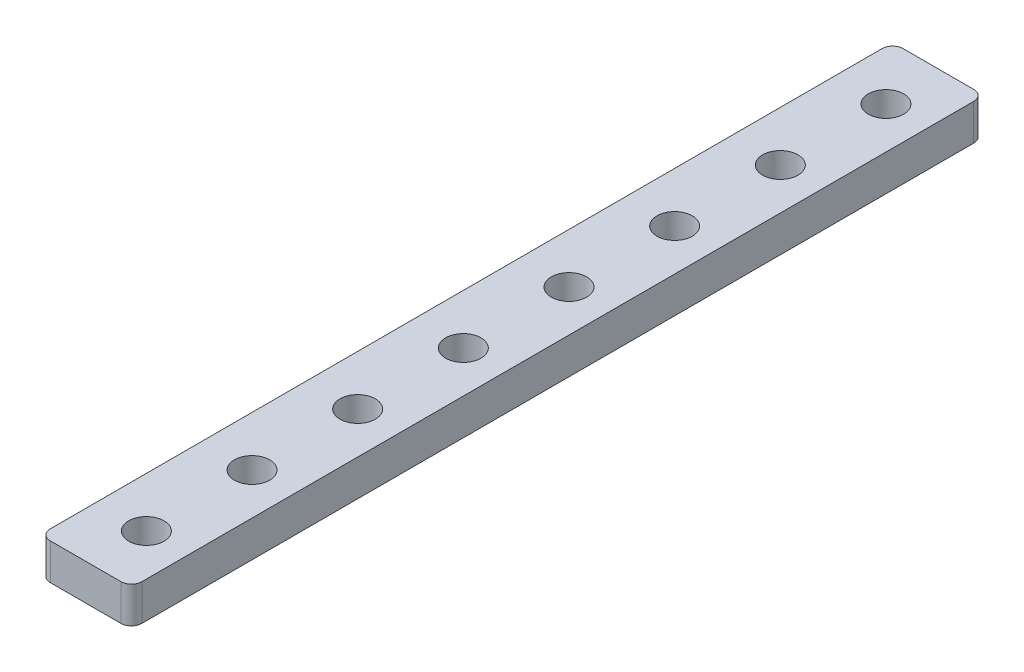
ISO-10303-21;
HEADER;
FILE_DESCRIPTION(('STEP AP214'),'2;1');
FILE_NAME('part.step','',(''),(''),'','','');
FILE_SCHEMA(('AUTOMOTIVE_DESIGN { 1 0 10303 214 1 1 1 1 }'));
ENDSEC;
DATA;
#1=APPLICATION_CONTEXT('core data for automotive mechanical design processes');
#2=APPLICATION_PROTOCOL_DEFINITION('international standard','automotive_design',2000,#1);
#3=PRODUCT_CONTEXT('',#1,'mechanical');
#4=PRODUCT('Part','Part','',(#3));
#5=PRODUCT_RELATED_PRODUCT_CATEGORY('part','',(#4));
#6=PRODUCT_DEFINITION_FORMATION('','',#4);
#7=PRODUCT_DEFINITION_CONTEXT('part definition',#1,'design');
#8=PRODUCT_DEFINITION('design','',#6,#7);
#9=PRODUCT_DEFINITION_SHAPE('','',#8);
#10=(LENGTH_UNIT() NAMED_UNIT(*) SI_UNIT(.MILLI.,.METRE.));
#11=(NAMED_UNIT(*) PLANE_ANGLE_UNIT() SI_UNIT($,.RADIAN.));
#12=(NAMED_UNIT(*) SI_UNIT($,.STERADIAN.) SOLID_ANGLE_UNIT());
#13=UNCERTAINTY_MEASURE_WITH_UNIT(LENGTH_MEASURE(1.E-05),#10,'distance_accuracy_value','');
#14=(GEOMETRIC_REPRESENTATION_CONTEXT(3) GLOBAL_UNCERTAINTY_ASSIGNED_CONTEXT((#13)) GLOBAL_UNIT_ASSIGNED_CONTEXT((#10,
#11,#12)) REPRESENTATION_CONTEXT('',''));
#15=CARTESIAN_POINT('',(0.,0.,0.));
#16=DIRECTION('',(0.,0.,1.));
#17=DIRECTION('',(1.,0.,0.));
#18=AXIS2_PLACEMENT_3D('',#15,#16,#17);
#19=CARTESIAN_POINT('',(0.,0.,0.));
#20=DIRECTION('',(0.,1.,0.));
#21=DIRECTION('',(0.,0.,1.));
#22=AXIS2_PLACEMENT_3D('',#19,#20,#21);
#23=PLANE('',#22);
#24=CARTESIAN_POINT('',(0.,0.,-88.9));
#25=DIRECTION('',(0.,-1.,0.));
#26=DIRECTION('',(0.,0.,-1.));
#27=AXIS2_PLACEMENT_3D('',#24,#25,#26);
#28=CIRCLE('',#27,4.24999999999999);
#29=CARTESIAN_POINT('',(0.,0.,-93.15));
#30=VERTEX_POINT('',#29);
#31=EDGE_CURVE('E271',#30,#30,#28,.T.);
#32=ORIENTED_EDGE('',*,*,#31,.F.);
#33=EDGE_LOOP('',(#32));
#34=FACE_BOUND('',#33,.T.);
#35=CARTESIAN_POINT('',(0.,0.,-63.5));
#36=DIRECTION('',(0.,-1.,0.));
#37=DIRECTION('',(0.,0.,-1.));
#38=AXIS2_PLACEMENT_3D('',#35,#36,#37);
#39=CIRCLE('',#38,4.24999999999999);
#40=CARTESIAN_POINT('',(0.,0.,-67.75));
#41=VERTEX_POINT('',#40);
#42=EDGE_CURVE('E263',#41,#41,#39,.T.);
#43=ORIENTED_EDGE('',*,*,#42,.F.);
#44=EDGE_LOOP('',(#43));
#45=FACE_BOUND('',#44,.T.);
#46=CARTESIAN_POINT('',(0.,0.,-38.1));
#47=DIRECTION('',(0.,-1.,0.));
#48=DIRECTION('',(0.,0.,-1.));
#49=AXIS2_PLACEMENT_3D('',#46,#47,#48);
#50=CIRCLE('',#49,4.24999999999999);
#51=CARTESIAN_POINT('',(0.,0.,-42.35));
#52=VERTEX_POINT('',#51);
#53=EDGE_CURVE('E255',#52,#52,#50,.T.);
#54=ORIENTED_EDGE('',*,*,#53,.F.);
#55=EDGE_LOOP('',(#54));
#56=FACE_BOUND('',#55,.T.);
#57=CARTESIAN_POINT('',(0.,0.,-12.7));
#58=DIRECTION('',(0.,-1.,0.));
#59=DIRECTION('',(0.,0.,-1.));
#60=AXIS2_PLACEMENT_3D('',#57,#58,#59);
#61=CIRCLE('',#60,4.24999999999999);
#62=CARTESIAN_POINT('',(0.,0.,-16.95));
#63=VERTEX_POINT('',#62);
#64=EDGE_CURVE('E247',#63,#63,#61,.T.);
#65=ORIENTED_EDGE('',*,*,#64,.F.);
#66=EDGE_LOOP('',(#65));
#67=FACE_BOUND('',#66,.T.);
#68=CARTESIAN_POINT('',(0.,0.,12.7));
#69=DIRECTION('',(0.,-1.,0.));
#70=DIRECTION('',(0.,0.,-1.));
#71=AXIS2_PLACEMENT_3D('',#68,#69,#70);
#72=CIRCLE('',#71,4.24999999999999);
#73=CARTESIAN_POINT('',(0.,0.,8.45000000000002));
#74=VERTEX_POINT('',#73);
#75=EDGE_CURVE('E239',#74,#74,#72,.T.);
#76=ORIENTED_EDGE('',*,*,#75,.F.);
#77=EDGE_LOOP('',(#76));
#78=FACE_BOUND('',#77,.T.);
#79=CARTESIAN_POINT('',(0.,0.,63.5));
#80=DIRECTION('',(0.,-1.,0.));
#81=DIRECTION('',(0.,0.,-1.));
#82=AXIS2_PLACEMENT_3D('',#79,#80,#81);
#83=CIRCLE('',#82,4.24999999999999);
#84=CARTESIAN_POINT('',(0.,0.,59.25));
#85=VERTEX_POINT('',#84);
#86=EDGE_CURVE('E223',#85,#85,#83,.T.);
#87=ORIENTED_EDGE('',*,*,#86,.F.);
#88=EDGE_LOOP('',(#87));
#89=FACE_BOUND('',#88,.T.);
#90=DIRECTION('',(0.,0.,-1.));
#91=VECTOR('',#90,1.);
#92=CARTESIAN_POINT('',(10.,0.,-102.5));
#93=LINE('',#92,#91);
#94=CARTESIAN_POINT('',(10.,0.,99.9999999999999));
#95=VERTEX_POINT('',#94);
#96=CARTESIAN_POINT('',(10.,0.,-100.));
#97=VERTEX_POINT('',#96);
#98=EDGE_CURVE('E130',#95,#97,#93,.T.);
#99=ORIENTED_EDGE('',*,*,#98,.F.);
#100=CARTESIAN_POINT('',(7.50000000000005,0.,100.));
#101=DIRECTION('',(0.,1.,0.));
#102=DIRECTION('',(0.,0.,1.));
#103=AXIS2_PLACEMENT_3D('',#100,#101,#102);
#104=CIRCLE('',#103,2.5);
#105=CARTESIAN_POINT('',(7.50000000000004,0.,102.5));
#106=VERTEX_POINT('',#105);
#107=EDGE_CURVE('E112',#95,#106,#104,.F.);
#108=ORIENTED_EDGE('',*,*,#107,.T.);
#109=DIRECTION('',(1.,0.,0.));
#110=VECTOR('',#109,1.);
#111=CARTESIAN_POINT('',(-12.,0.,102.5));
#112=LINE('',#111,#110);
#113=CARTESIAN_POINT('',(-9.49999999999998,0.,102.5));
#114=VERTEX_POINT('',#113);
#115=EDGE_CURVE('E159',#114,#106,#112,.T.);
#116=ORIENTED_EDGE('',*,*,#115,.F.);
#117=CARTESIAN_POINT('',(-9.49999999999998,0.,100.));
#118=DIRECTION('',(0.,1.,0.));
#119=DIRECTION('',(0.,0.,1.));
#120=AXIS2_PLACEMENT_3D('',#117,#118,#119);
#121=CIRCLE('',#120,2.5);
#122=CARTESIAN_POINT('',(-12.,0.,99.9999999999999));
#123=VERTEX_POINT('',#122);
#124=EDGE_CURVE('E135',#114,#123,#121,.F.);
#125=ORIENTED_EDGE('',*,*,#124,.T.);
#126=DIRECTION('',(0.,0.,1.));
#127=VECTOR('',#126,1.);
#128=CARTESIAN_POINT('',(-12.,0.,-102.5));
#129=LINE('',#128,#127);
#130=CARTESIAN_POINT('',(-12.,0.,-100.));
#131=VERTEX_POINT('',#130);
#132=EDGE_CURVE('E148',#131,#123,#129,.T.);
#133=ORIENTED_EDGE('',*,*,#132,.F.);
#134=CARTESIAN_POINT('',(-9.49999999999998,0.,-100.));
#135=DIRECTION('',(0.,1.,0.));
#136=DIRECTION('',(0.,0.,1.));
#137=AXIS2_PLACEMENT_3D('',#134,#135,#136);
#138=CIRCLE('',#137,2.5);
#139=CARTESIAN_POINT('',(-9.49999999999998,0.,-102.5));
#140=VERTEX_POINT('',#139);
#141=EDGE_CURVE('E124',#131,#140,#138,.F.);
#142=ORIENTED_EDGE('',*,*,#141,.T.);
#143=DIRECTION('',(-1.,0.,0.));
#144=VECTOR('',#143,1.);
#145=CARTESIAN_POINT('',(-12.,0.,-102.5));
#146=LINE('',#145,#144);
#147=CARTESIAN_POINT('',(7.50000000000004,0.,-102.5));
#148=VERTEX_POINT('',#147);
#149=EDGE_CURVE('E142',#148,#140,#146,.T.);
#150=ORIENTED_EDGE('',*,*,#149,.F.);
#151=CARTESIAN_POINT('',(7.50000000000005,0.,-100.));
#152=DIRECTION('',(0.,1.,0.));
#153=DIRECTION('',(0.,0.,1.));
#154=AXIS2_PLACEMENT_3D('',#151,#152,#153);
#155=CIRCLE('',#154,2.5);
#156=EDGE_CURVE('E140',#148,#97,#155,.F.);
#157=ORIENTED_EDGE('',*,*,#156,.T.);
#158=EDGE_LOOP('',(#99,#108,#116,#125,#133,#142,#150,#157));
#159=FACE_BOUND('',#158,.T.);
#160=CARTESIAN_POINT('',(0.,0.,88.9));
#161=DIRECTION('',(0.,-1.,0.));
#162=DIRECTION('',(0.,0.,-1.));
#163=AXIS2_PLACEMENT_3D('',#160,#161,#162);
#164=CIRCLE('',#163,4.24999999999999);
#165=CARTESIAN_POINT('',(0.,0.,84.65));
#166=VERTEX_POINT('',#165);
#167=EDGE_CURVE('E151',#166,#166,#164,.T.);
#168=ORIENTED_EDGE('',*,*,#167,.F.);
#169=EDGE_LOOP('',(#168));
#170=FACE_BOUND('',#169,.T.);
#171=CARTESIAN_POINT('',(0.,0.,38.1));
#172=DIRECTION('',(0.,-1.,0.));
#173=DIRECTION('',(0.,0.,-1.));
#174=AXIS2_PLACEMENT_3D('',#171,#172,#173);
#175=CIRCLE('',#174,4.24999999999999);
#176=CARTESIAN_POINT('',(0.,0.,33.85));
#177=VERTEX_POINT('',#176);
#178=EDGE_CURVE('E231',#177,#177,#175,.T.);
#179=ORIENTED_EDGE('',*,*,#178,.F.);
#180=EDGE_LOOP('',(#179));
#181=FACE_BOUND('',#180,.T.);
#182=ADVANCED_FACE('F45',(#34,#45,#56,#67,#78,#89,#159,#170,#181),#23,.F.);
#183=CARTESIAN_POINT('',(10.,8.7,-102.5));
#184=DIRECTION('',(-1.,0.,0.));
#185=DIRECTION('',(0.,0.,1.));
#186=AXIS2_PLACEMENT_3D('',#183,#184,#185);
#187=PLANE('',#186);
#188=DIRECTION('',(0.,0.,-1.));
#189=VECTOR('',#188,1.);
#190=CARTESIAN_POINT('',(10.,8.7,-102.5));
#191=LINE('',#190,#189);
#192=CARTESIAN_POINT('',(10.,8.7,99.9999999999999));
#193=VERTEX_POINT('',#192);
#194=CARTESIAN_POINT('',(10.,8.7,-100.));
#195=VERTEX_POINT('',#194);
#196=EDGE_CURVE('E133',#193,#195,#191,.T.);
#197=ORIENTED_EDGE('',*,*,#196,.F.);
#198=DIRECTION('',(0.,-1.,0.));
#199=VECTOR('',#198,1.);
#200=CARTESIAN_POINT('',(10.,8.7,100.));
#201=LINE('',#200,#199);
#202=EDGE_CURVE('E116',#193,#95,#201,.T.);
#203=ORIENTED_EDGE('',*,*,#202,.T.);
#204=ORIENTED_EDGE('',*,*,#98,.T.);
#205=DIRECTION('',(0.,-1.,0.));
#206=VECTOR('',#205,1.);
#207=CARTESIAN_POINT('',(10.,8.7,-100.));
#208=LINE('',#207,#206);
#209=EDGE_CURVE('E136',#97,#195,#208,.F.);
#210=ORIENTED_EDGE('',*,*,#209,.T.);
#211=EDGE_LOOP('',(#197,#203,#204,#210));
#212=FACE_BOUND('',#211,.T.);
#213=ADVANCED_FACE('F129',(#212),#187,.F.);
#214=CARTESIAN_POINT('',(-12.,8.7,-102.5));
#215=DIRECTION('',(0.,0.,1.));
#216=DIRECTION('',(1.,0.,0.));
#217=AXIS2_PLACEMENT_3D('',#214,#215,#216);
#218=PLANE('',#217);
#219=ORIENTED_EDGE('',*,*,#149,.T.);
#220=DIRECTION('',(0.,-1.,0.));
#221=VECTOR('',#220,1.);
#222=CARTESIAN_POINT('',(-9.49999999999998,8.7,-102.5));
#223=LINE('',#222,#221);
#224=CARTESIAN_POINT('',(-9.49999999999998,8.7,-102.5));
#225=VERTEX_POINT('',#224);
#226=EDGE_CURVE('E11',#140,#225,#223,.F.);
#227=ORIENTED_EDGE('',*,*,#226,.T.);
#228=DIRECTION('',(-1.,0.,0.));
#229=VECTOR('',#228,1.);
#230=CARTESIAN_POINT('',(-12.,8.7,-102.5));
#231=LINE('',#230,#229);
#232=CARTESIAN_POINT('',(7.50000000000004,8.7,-102.5));
#233=VERTEX_POINT('',#232);
#234=EDGE_CURVE('E198',#233,#225,#231,.T.);
#235=ORIENTED_EDGE('',*,*,#234,.F.);
#236=DIRECTION('',(0.,-1.,0.));
#237=VECTOR('',#236,1.);
#238=CARTESIAN_POINT('',(7.50000000000005,8.7,-102.5));
#239=LINE('',#238,#237);
#240=EDGE_CURVE('E54',#233,#148,#239,.T.);
#241=ORIENTED_EDGE('',*,*,#240,.T.);
#242=EDGE_LOOP('',(#219,#227,#235,#241));
#243=FACE_BOUND('',#242,.T.);
#244=ADVANCED_FACE('F196',(#243),#218,.F.);
#245=CARTESIAN_POINT('',(-12.,8.7,-102.5));
#246=DIRECTION('',(1.,0.,0.));
#247=DIRECTION('',(0.,0.,-1.));
#248=AXIS2_PLACEMENT_3D('',#245,#246,#247);
#249=PLANE('',#248);
#250=DIRECTION('',(0.,0.,1.));
#251=VECTOR('',#250,1.);
#252=CARTESIAN_POINT('',(-12.,8.7,-102.5));
#253=LINE('',#252,#251);
#254=CARTESIAN_POINT('',(-12.,8.7,-100.));
#255=VERTEX_POINT('',#254);
#256=CARTESIAN_POINT('',(-12.,8.7,99.9999999999999));
#257=VERTEX_POINT('',#256);
#258=EDGE_CURVE('E206',#255,#257,#253,.T.);
#259=ORIENTED_EDGE('',*,*,#258,.F.);
#260=DIRECTION('',(0.,-1.,0.));
#261=VECTOR('',#260,1.);
#262=CARTESIAN_POINT('',(-12.,8.7,-100.));
#263=LINE('',#262,#261);
#264=EDGE_CURVE('E188',#255,#131,#263,.T.);
#265=ORIENTED_EDGE('',*,*,#264,.T.);
#266=ORIENTED_EDGE('',*,*,#132,.T.);
#267=DIRECTION('',(0.,-1.,0.));
#268=VECTOR('',#267,1.);
#269=CARTESIAN_POINT('',(-12.,8.7,100.));
#270=LINE('',#269,#268);
#271=EDGE_CURVE('E61',#123,#257,#270,.F.);
#272=ORIENTED_EDGE('',*,*,#271,.T.);
#273=EDGE_LOOP('',(#259,#265,#266,#272));
#274=FACE_BOUND('',#273,.T.);
#275=ADVANCED_FACE('F205',(#274),#249,.F.);
#276=CARTESIAN_POINT('',(-12.,8.7,102.5));
#277=DIRECTION('',(0.,0.,-1.));
#278=DIRECTION('',(-1.,0.,0.));
#279=AXIS2_PLACEMENT_3D('',#276,#277,#278);
#280=PLANE('',#279);
#281=ORIENTED_EDGE('',*,*,#115,.T.);
#282=DIRECTION('',(0.,-1.,0.));
#283=VECTOR('',#282,1.);
#284=CARTESIAN_POINT('',(7.50000000000005,8.7,102.5));
#285=LINE('',#284,#283);
#286=CARTESIAN_POINT('',(7.50000000000004,8.7,102.5));
#287=VERTEX_POINT('',#286);
#288=EDGE_CURVE('E117',#106,#287,#285,.F.);
#289=ORIENTED_EDGE('',*,*,#288,.T.);
#290=DIRECTION('',(1.,0.,0.));
#291=VECTOR('',#290,1.);
#292=CARTESIAN_POINT('',(-12.,8.7,102.5));
#293=LINE('',#292,#291);
#294=CARTESIAN_POINT('',(-9.49999999999998,8.7,102.5));
#295=VERTEX_POINT('',#294);
#296=EDGE_CURVE('E154',#295,#287,#293,.T.);
#297=ORIENTED_EDGE('',*,*,#296,.F.);
#298=DIRECTION('',(0.,-1.,0.));
#299=VECTOR('',#298,1.);
#300=CARTESIAN_POINT('',(-9.49999999999998,8.7,102.5));
#301=LINE('',#300,#299);
#302=EDGE_CURVE('E123',#295,#114,#301,.T.);
#303=ORIENTED_EDGE('',*,*,#302,.T.);
#304=EDGE_LOOP('',(#281,#289,#297,#303));
#305=FACE_BOUND('',#304,.T.);
#306=ADVANCED_FACE('F303',(#305),#280,.F.);
#307=CARTESIAN_POINT('',(0.,8.7,0.));
#308=DIRECTION('',(0.,1.,0.));
#309=DIRECTION('',(0.,0.,1.));
#310=AXIS2_PLACEMENT_3D('',#307,#308,#309);
#311=PLANE('',#310);
#312=CARTESIAN_POINT('',(0.,8.7,-88.9));
#313=DIRECTION('',(0.,1.,0.));
#314=DIRECTION('',(0.,0.,1.));
#315=AXIS2_PLACEMENT_3D('',#312,#313,#314);
#316=CIRCLE('',#315,4.24999999999999);
#317=CARTESIAN_POINT('',(0.,8.7,-84.65));
#318=VERTEX_POINT('',#317);
#319=EDGE_CURVE('E267',#318,#318,#316,.T.);
#320=ORIENTED_EDGE('',*,*,#319,.F.);
#321=EDGE_LOOP('',(#320));
#322=FACE_BOUND('',#321,.T.);
#323=CARTESIAN_POINT('',(0.,8.7,-63.5));
#324=DIRECTION('',(0.,1.,0.));
#325=DIRECTION('',(0.,0.,1.));
#326=AXIS2_PLACEMENT_3D('',#323,#324,#325);
#327=CIRCLE('',#326,4.24999999999999);
#328=CARTESIAN_POINT('',(0.,8.7,-59.25));
#329=VERTEX_POINT('',#328);
#330=EDGE_CURVE('E259',#329,#329,#327,.T.);
#331=ORIENTED_EDGE('',*,*,#330,.F.);
#332=EDGE_LOOP('',(#331));
#333=FACE_BOUND('',#332,.T.);
#334=CARTESIAN_POINT('',(0.,8.7,-38.1));
#335=DIRECTION('',(0.,1.,0.));
#336=DIRECTION('',(0.,0.,1.));
#337=AXIS2_PLACEMENT_3D('',#334,#335,#336);
#338=CIRCLE('',#337,4.24999999999999);
#339=CARTESIAN_POINT('',(0.,8.7,-33.85));
#340=VERTEX_POINT('',#339);
#341=EDGE_CURVE('E251',#340,#340,#338,.T.);
#342=ORIENTED_EDGE('',*,*,#341,.F.);
#343=EDGE_LOOP('',(#342));
#344=FACE_BOUND('',#343,.T.);
#345=CARTESIAN_POINT('',(0.,8.7,-12.7));
#346=DIRECTION('',(0.,1.,0.));
#347=DIRECTION('',(0.,0.,1.));
#348=AXIS2_PLACEMENT_3D('',#345,#346,#347);
#349=CIRCLE('',#348,4.24999999999999);
#350=CARTESIAN_POINT('',(0.,8.7,-8.45000000000001));
#351=VERTEX_POINT('',#350);
#352=EDGE_CURVE('E243',#351,#351,#349,.T.);
#353=ORIENTED_EDGE('',*,*,#352,.F.);
#354=EDGE_LOOP('',(#353));
#355=FACE_BOUND('',#354,.T.);
#356=CARTESIAN_POINT('',(0.,8.7,12.7));
#357=DIRECTION('',(0.,1.,0.));
#358=DIRECTION('',(0.,0.,1.));
#359=AXIS2_PLACEMENT_3D('',#356,#357,#358);
#360=CIRCLE('',#359,4.24999999999999);
#361=CARTESIAN_POINT('',(0.,8.7,16.95));
#362=VERTEX_POINT('',#361);
#363=EDGE_CURVE('E235',#362,#362,#360,.T.);
#364=ORIENTED_EDGE('',*,*,#363,.F.);
#365=EDGE_LOOP('',(#364));
#366=FACE_BOUND('',#365,.T.);
#367=CARTESIAN_POINT('',(0.,8.7,38.1));
#368=DIRECTION('',(0.,1.,0.));
#369=DIRECTION('',(0.,0.,1.));
#370=AXIS2_PLACEMENT_3D('',#367,#368,#369);
#371=CIRCLE('',#370,4.24999999999999);
#372=CARTESIAN_POINT('',(0.,8.7,42.35));
#373=VERTEX_POINT('',#372);
#374=EDGE_CURVE('E227',#373,#373,#371,.T.);
#375=ORIENTED_EDGE('',*,*,#374,.F.);
#376=EDGE_LOOP('',(#375));
#377=FACE_BOUND('',#376,.T.);
#378=CARTESIAN_POINT('',(0.,8.7,63.5));
#379=DIRECTION('',(0.,1.,0.));
#380=DIRECTION('',(0.,0.,1.));
#381=AXIS2_PLACEMENT_3D('',#378,#379,#380);
#382=CIRCLE('',#381,4.24999999999999);
#383=CARTESIAN_POINT('',(0.,8.7,67.75));
#384=VERTEX_POINT('',#383);
#385=EDGE_CURVE('E219',#384,#384,#382,.T.);
#386=ORIENTED_EDGE('',*,*,#385,.F.);
#387=EDGE_LOOP('',(#386));
#388=FACE_BOUND('',#387,.T.);
#389=CARTESIAN_POINT('',(0.,8.7,88.9));
#390=DIRECTION('',(0.,1.,0.));
#391=DIRECTION('',(0.,0.,1.));
#392=AXIS2_PLACEMENT_3D('',#389,#390,#391);
#393=CIRCLE('',#392,4.24999999999999);
#394=CARTESIAN_POINT('',(0.,8.7,93.15));
#395=VERTEX_POINT('',#394);
#396=EDGE_CURVE('E143',#395,#395,#393,.T.);
#397=ORIENTED_EDGE('',*,*,#396,.F.);
#398=EDGE_LOOP('',(#397));
#399=FACE_BOUND('',#398,.T.);
#400=ORIENTED_EDGE('',*,*,#296,.T.);
#401=CARTESIAN_POINT('',(7.50000000000005,8.7,100.));
#402=DIRECTION('',(0.,1.,0.));
#403=DIRECTION('',(0.,0.,1.));
#404=AXIS2_PLACEMENT_3D('',#401,#402,#403);
#405=CIRCLE('',#404,2.5);
#406=EDGE_CURVE('E183',#287,#193,#405,.T.);
#407=ORIENTED_EDGE('',*,*,#406,.T.);
#408=ORIENTED_EDGE('',*,*,#196,.T.);
#409=CARTESIAN_POINT('',(7.50000000000005,8.7,-100.));
#410=DIRECTION('',(0.,1.,0.));
#411=DIRECTION('',(0.,0.,1.));
#412=AXIS2_PLACEMENT_3D('',#409,#410,#411);
#413=CIRCLE('',#412,2.5);
#414=EDGE_CURVE('E178',#195,#233,#413,.T.);
#415=ORIENTED_EDGE('',*,*,#414,.T.);
#416=ORIENTED_EDGE('',*,*,#234,.T.);
#417=CARTESIAN_POINT('',(-9.49999999999998,8.7,-100.));
#418=DIRECTION('',(0.,1.,0.));
#419=DIRECTION('',(0.,0.,1.));
#420=AXIS2_PLACEMENT_3D('',#417,#418,#419);
#421=CIRCLE('',#420,2.5);
#422=EDGE_CURVE('E68',#225,#255,#421,.T.);
#423=ORIENTED_EDGE('',*,*,#422,.T.);
#424=ORIENTED_EDGE('',*,*,#258,.T.);
#425=CARTESIAN_POINT('',(-9.49999999999998,8.7,100.));
#426=DIRECTION('',(0.,1.,0.));
#427=DIRECTION('',(0.,0.,1.));
#428=AXIS2_PLACEMENT_3D('',#425,#426,#427);
#429=CIRCLE('',#428,2.5);
#430=EDGE_CURVE('E175',#257,#295,#429,.T.);
#431=ORIENTED_EDGE('',*,*,#430,.T.);
#432=EDGE_LOOP('',(#400,#407,#408,#415,#416,#423,#424,#431));
#433=FACE_BOUND('',#432,.T.);
#434=ADVANCED_FACE('F300',(#322,#333,#344,#355,#366,#377,#388,#399,#433),#311,.T.);
#435=CARTESIAN_POINT('',(0.,0.,88.9));
#436=DIRECTION('',(0.,-1.,0.));
#437=DIRECTION('',(0.,0.,-1.));
#438=AXIS2_PLACEMENT_3D('',#435,#436,#437);
#439=CYLINDRICAL_SURFACE('',#438,4.24999999999999);
#440=ORIENTED_EDGE('',*,*,#167,.T.);
#441=EDGE_LOOP('',(#440));
#442=FACE_BOUND('',#441,.T.);
#443=ORIENTED_EDGE('',*,*,#396,.T.);
#444=EDGE_LOOP('',(#443));
#445=FACE_BOUND('',#444,.T.);
#446=ADVANCED_FACE('F296',(#442,#445),#439,.F.);
#447=CARTESIAN_POINT('',(0.,0.,63.5));
#448=DIRECTION('',(0.,-1.,0.));
#449=DIRECTION('',(0.,0.,-1.));
#450=AXIS2_PLACEMENT_3D('',#447,#448,#449);
#451=CYLINDRICAL_SURFACE('',#450,4.24999999999999);
#452=ORIENTED_EDGE('',*,*,#86,.T.);
#453=EDGE_LOOP('',(#452));
#454=FACE_BOUND('',#453,.T.);
#455=ORIENTED_EDGE('',*,*,#385,.T.);
#456=EDGE_LOOP('',(#455));
#457=FACE_BOUND('',#456,.T.);
#458=ADVANCED_FACE('F292',(#454,#457),#451,.F.);
#459=CARTESIAN_POINT('',(0.,0.,38.1));
#460=DIRECTION('',(0.,-1.,0.));
#461=DIRECTION('',(0.,0.,-1.));
#462=AXIS2_PLACEMENT_3D('',#459,#460,#461);
#463=CYLINDRICAL_SURFACE('',#462,4.24999999999999);
#464=ORIENTED_EDGE('',*,*,#178,.T.);
#465=EDGE_LOOP('',(#464));
#466=FACE_BOUND('',#465,.T.);
#467=ORIENTED_EDGE('',*,*,#374,.T.);
#468=EDGE_LOOP('',(#467));
#469=FACE_BOUND('',#468,.T.);
#470=ADVANCED_FACE('F295',(#466,#469),#463,.F.);
#471=CARTESIAN_POINT('',(0.,0.,12.7));
#472=DIRECTION('',(0.,-1.,0.));
#473=DIRECTION('',(0.,0.,-1.));
#474=AXIS2_PLACEMENT_3D('',#471,#472,#473);
#475=CYLINDRICAL_SURFACE('',#474,4.24999999999999);
#476=ORIENTED_EDGE('',*,*,#75,.T.);
#477=EDGE_LOOP('',(#476));
#478=FACE_BOUND('',#477,.T.);
#479=ORIENTED_EDGE('',*,*,#363,.T.);
#480=EDGE_LOOP('',(#479));
#481=FACE_BOUND('',#480,.T.);
#482=ADVANCED_FACE('F336',(#478,#481),#475,.F.);
#483=CARTESIAN_POINT('',(0.,0.,-12.7));
#484=DIRECTION('',(0.,-1.,0.));
#485=DIRECTION('',(0.,0.,-1.));
#486=AXIS2_PLACEMENT_3D('',#483,#484,#485);
#487=CYLINDRICAL_SURFACE('',#486,4.24999999999999);
#488=ORIENTED_EDGE('',*,*,#64,.T.);
#489=EDGE_LOOP('',(#488));
#490=FACE_BOUND('',#489,.T.);
#491=ORIENTED_EDGE('',*,*,#352,.T.);
#492=EDGE_LOOP('',(#491));
#493=FACE_BOUND('',#492,.T.);
#494=ADVANCED_FACE('F340',(#490,#493),#487,.F.);
#495=CARTESIAN_POINT('',(0.,0.,-38.1));
#496=DIRECTION('',(0.,-1.,0.));
#497=DIRECTION('',(0.,0.,-1.));
#498=AXIS2_PLACEMENT_3D('',#495,#496,#497);
#499=CYLINDRICAL_SURFACE('',#498,4.24999999999999);
#500=ORIENTED_EDGE('',*,*,#53,.T.);
#501=EDGE_LOOP('',(#500));
#502=FACE_BOUND('',#501,.T.);
#503=ORIENTED_EDGE('',*,*,#341,.T.);
#504=EDGE_LOOP('',(#503));
#505=FACE_BOUND('',#504,.T.);
#506=ADVANCED_FACE('F344',(#502,#505),#499,.F.);
#507=CARTESIAN_POINT('',(0.,0.,-63.5));
#508=DIRECTION('',(0.,-1.,0.));
#509=DIRECTION('',(0.,0.,-1.));
#510=AXIS2_PLACEMENT_3D('',#507,#508,#509);
#511=CYLINDRICAL_SURFACE('',#510,4.24999999999999);
#512=ORIENTED_EDGE('',*,*,#42,.T.);
#513=EDGE_LOOP('',(#512));
#514=FACE_BOUND('',#513,.T.);
#515=ORIENTED_EDGE('',*,*,#330,.T.);
#516=EDGE_LOOP('',(#515));
#517=FACE_BOUND('',#516,.T.);
#518=ADVANCED_FACE('F348',(#514,#517),#511,.F.);
#519=CARTESIAN_POINT('',(0.,0.,-88.9));
#520=DIRECTION('',(0.,-1.,0.));
#521=DIRECTION('',(0.,0.,-1.));
#522=AXIS2_PLACEMENT_3D('',#519,#520,#521);
#523=CYLINDRICAL_SURFACE('',#522,4.24999999999999);
#524=ORIENTED_EDGE('',*,*,#31,.T.);
#525=EDGE_LOOP('',(#524));
#526=FACE_BOUND('',#525,.T.);
#527=ORIENTED_EDGE('',*,*,#319,.T.);
#528=EDGE_LOOP('',(#527));
#529=FACE_BOUND('',#528,.T.);
#530=ADVANCED_FACE('F276',(#526,#529),#523,.F.);
#531=CARTESIAN_POINT('',(7.50000000000005,8.7,100.));
#532=DIRECTION('',(0.,-1.,0.));
#533=DIRECTION('',(0.,0.,-1.));
#534=AXIS2_PLACEMENT_3D('',#531,#532,#533);
#535=CYLINDRICAL_SURFACE('',#534,2.5);
#536=ORIENTED_EDGE('',*,*,#406,.F.);
#537=ORIENTED_EDGE('',*,*,#288,.F.);
#538=ORIENTED_EDGE('',*,*,#107,.F.);
#539=ORIENTED_EDGE('',*,*,#202,.F.);
#540=EDGE_LOOP('',(#536,#537,#538,#539));
#541=FACE_BOUND('',#540,.T.);
#542=ADVANCED_FACE('F115',(#541),#535,.T.);
#543=CARTESIAN_POINT('',(-9.49999999999998,8.7,-100.));
#544=DIRECTION('',(0.,-1.,0.));
#545=DIRECTION('',(0.,0.,-1.));
#546=AXIS2_PLACEMENT_3D('',#543,#544,#545);
#547=CYLINDRICAL_SURFACE('',#546,2.5);
#548=ORIENTED_EDGE('',*,*,#422,.F.);
#549=ORIENTED_EDGE('',*,*,#226,.F.);
#550=ORIENTED_EDGE('',*,*,#141,.F.);
#551=ORIENTED_EDGE('',*,*,#264,.F.);
#552=EDGE_LOOP('',(#548,#549,#550,#551));
#553=FACE_BOUND('',#552,.T.);
#554=ADVANCED_FACE('F204',(#553),#547,.T.);
#555=CARTESIAN_POINT('',(7.50000000000005,8.7,-100.));
#556=DIRECTION('',(0.,-1.,0.));
#557=DIRECTION('',(0.,0.,-1.));
#558=AXIS2_PLACEMENT_3D('',#555,#556,#557);
#559=CYLINDRICAL_SURFACE('',#558,2.5);
#560=ORIENTED_EDGE('',*,*,#414,.F.);
#561=ORIENTED_EDGE('',*,*,#209,.F.);
#562=ORIENTED_EDGE('',*,*,#156,.F.);
#563=ORIENTED_EDGE('',*,*,#240,.F.);
#564=EDGE_LOOP('',(#560,#561,#562,#563));
#565=FACE_BOUND('',#564,.T.);
#566=ADVANCED_FACE('F312',(#565),#559,.T.);
#567=CARTESIAN_POINT('',(-9.49999999999998,8.7,100.));
#568=DIRECTION('',(0.,-1.,0.));
#569=DIRECTION('',(0.,0.,-1.));
#570=AXIS2_PLACEMENT_3D('',#567,#568,#569);
#571=CYLINDRICAL_SURFACE('',#570,2.5);
#572=ORIENTED_EDGE('',*,*,#430,.F.);
#573=ORIENTED_EDGE('',*,*,#271,.F.);
#574=ORIENTED_EDGE('',*,*,#124,.F.);
#575=ORIENTED_EDGE('',*,*,#302,.F.);
#576=EDGE_LOOP('',(#572,#573,#574,#575));
#577=FACE_BOUND('',#576,.T.);
#578=ADVANCED_FACE('F47',(#577),#571,.T.);
#579=CLOSED_SHELL('',(#182,#213,#244,#275,#306,#434,#446,#458,#470,#482,#494,#506,#518,#530,
#542,#554,#566,#578));
#580=MANIFOLD_SOLID_BREP('B2',#579);
#581=ADVANCED_BREP_SHAPE_REPRESENTATION('',(#18,#580),#14);
#582=SHAPE_DEFINITION_REPRESENTATION(#9,#581);
ENDSEC;
END-ISO-10303-21;
